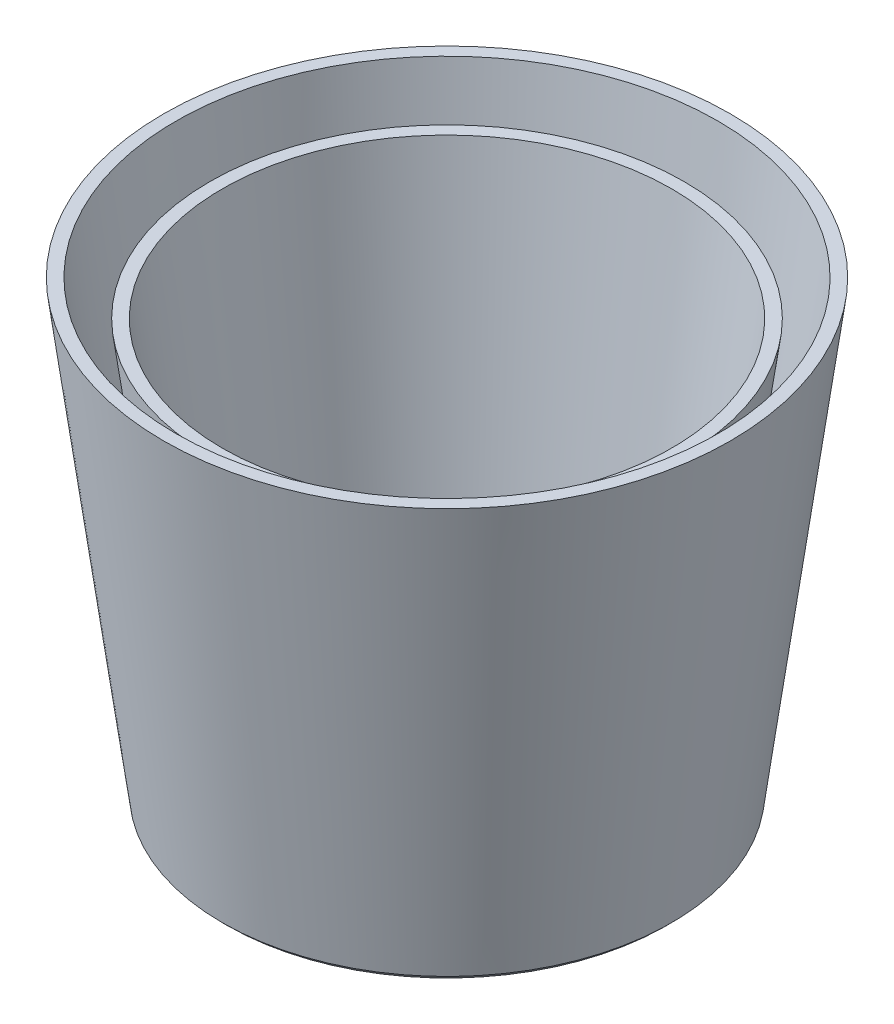
ISO-10303-21;
HEADER;
FILE_DESCRIPTION(('STEP AP214'),'2;1');
FILE_NAME('part.step','',(''),(''),'','','');
FILE_SCHEMA(('AUTOMOTIVE_DESIGN { 1 0 10303 214 1 1 1 1 }'));
ENDSEC;
DATA;
#1=APPLICATION_CONTEXT('core data for automotive mechanical design processes');
#2=APPLICATION_PROTOCOL_DEFINITION('international standard','automotive_design',2000,#1);
#3=PRODUCT_CONTEXT('',#1,'mechanical');
#4=PRODUCT('Part','Part','',(#3));
#5=PRODUCT_RELATED_PRODUCT_CATEGORY('part','',(#4));
#6=PRODUCT_DEFINITION_FORMATION('','',#4);
#7=PRODUCT_DEFINITION_CONTEXT('part definition',#1,'design');
#8=PRODUCT_DEFINITION('design','',#6,#7);
#9=PRODUCT_DEFINITION_SHAPE('','',#8);
#10=(LENGTH_UNIT() NAMED_UNIT(*) SI_UNIT(.MILLI.,.METRE.));
#11=(NAMED_UNIT(*) PLANE_ANGLE_UNIT() SI_UNIT($,.RADIAN.));
#12=(NAMED_UNIT(*) SI_UNIT($,.STERADIAN.) SOLID_ANGLE_UNIT());
#13=UNCERTAINTY_MEASURE_WITH_UNIT(LENGTH_MEASURE(1.E-05),#10,'distance_accuracy_value','');
#14=(GEOMETRIC_REPRESENTATION_CONTEXT(3) GLOBAL_UNCERTAINTY_ASSIGNED_CONTEXT((#13)) GLOBAL_UNIT_ASSIGNED_CONTEXT((#10,
#11,#12)) REPRESENTATION_CONTEXT('',''));
#15=CARTESIAN_POINT('',(0.,0.,0.));
#16=DIRECTION('',(0.,0.,1.));
#17=DIRECTION('',(1.,0.,0.));
#18=AXIS2_PLACEMENT_3D('',#15,#16,#17);
#19=CARTESIAN_POINT('',(0.,-108.,0.));
#20=DIRECTION('',(0.,1.,0.));
#21=DIRECTION('',(0.,0.,1.));
#22=AXIS2_PLACEMENT_3D('',#19,#20,#21);
#23=PLANE('',#22);
#24=CARTESIAN_POINT('',(0.,-108.,2.99999999999999));
#25=DIRECTION('',(0.,1.,0.));
#26=DIRECTION('',(0.,0.,1.));
#27=AXIS2_PLACEMENT_3D('',#24,#25,#26);
#28=CIRCLE('',#27,53.4015254030305);
#29=CARTESIAN_POINT('',(0.,-108.,56.4015254030305));
#30=VERTEX_POINT('',#29);
#31=EDGE_CURVE('E10',#30,#30,#28,.F.);
#32=ORIENTED_EDGE('',*,*,#31,.T.);
#33=EDGE_LOOP('',(#32));
#34=FACE_BOUND('',#33,.T.);
#35=ADVANCED_FACE('F39',(#34),#23,.F.);
#36=CARTESIAN_POINT('',(0.,-1.30454512571389,3.));
#37=DIRECTION('',(0.,1.,0.));
#38=DIRECTION('',(0.,0.,1.));
#39=AXIS2_PLACEMENT_3D('',#36,#37,#38);
#40=CONICAL_SURFACE('',#39,68.4404010443839,0.130827396074056);
#41=CARTESIAN_POINT('',(0.,-106.848484848485,2.99999999999999));
#42=DIRECTION('',(0.,-1.,0.));
#43=DIRECTION('',(0.,0.,-1.));
#44=AXIS2_PLACEMENT_3D('',#41,#42,#43);
#45=CIRCLE('',#44,54.5530405545457);
#46=CARTESIAN_POINT('',(0.,-106.848484848485,-51.5530405545457));
#47=VERTEX_POINT('',#46);
#48=EDGE_CURVE('E48',#47,#47,#45,.F.);
#49=ORIENTED_EDGE('',*,*,#48,.T.);
#50=EDGE_LOOP('',(#49));
#51=FACE_BOUND('',#50,.T.);
#52=CARTESIAN_POINT('',(0.,1.65066987090594,3.));
#53=DIRECTION('',(0.,1.,0.));
#54=DIRECTION('',(0.,0.,1.));
#55=AXIS2_PLACEMENT_3D('',#52,#53,#54);
#56=CIRCLE('',#55,68.8292451228865);
#57=CARTESIAN_POINT('',(0.,1.65066987090593,71.8292451228865));
#58=VERTEX_POINT('',#57);
#59=EDGE_CURVE('E144',#58,#58,#56,.T.);
#60=ORIENTED_EDGE('',*,*,#59,.F.);
#61=EDGE_LOOP('',(#60));
#62=FACE_BOUND('',#61,.T.);
#63=ADVANCED_FACE('F275',(#51,#62),#40,.T.);
#64=CARTESIAN_POINT('',(0.,1.65066987090594,-62.803387033928));
#65=DIRECTION('',(0.,-1.,0.));
#66=DIRECTION('',(0.,0.,-1.));
#67=AXIS2_PLACEMENT_3D('',#64,#65,#66);
#68=PLANE('',#67);
#69=CARTESIAN_POINT('',(0.,1.65066987090594,3.));
#70=DIRECTION('',(0.,1.,0.));
#71=DIRECTION('',(0.,0.,1.));
#72=AXIS2_PLACEMENT_3D('',#69,#70,#71);
#73=CIRCLE('',#72,65.803387033928);
#74=CARTESIAN_POINT('',(0.,1.65066987090593,68.803387033928));
#75=VERTEX_POINT('',#74);
#76=EDGE_CURVE('E148',#75,#75,#73,.T.);
#77=ORIENTED_EDGE('',*,*,#76,.F.);
#78=EDGE_LOOP('',(#77));
#79=FACE_BOUND('',#78,.T.);
#80=ORIENTED_EDGE('',*,*,#59,.T.);
#81=EDGE_LOOP('',(#80));
#82=FACE_BOUND('',#81,.T.);
#83=ADVANCED_FACE('F280',(#79,#82),#68,.F.);
#84=CARTESIAN_POINT('',(0.,0.,3.));
#85=DIRECTION('',(0.,1.,0.));
#86=DIRECTION('',(0.,0.,1.));
#87=AXIS2_PLACEMENT_3D('',#84,#85,#86);
#88=CONICAL_SURFACE('',#87,65.5861936298615,0.130827396074057);
#89=CARTESIAN_POINT('',(0.,-105.,2.99999999999999));
#90=DIRECTION('',(0.,1.,0.));
#91=DIRECTION('',(0.,0.,1.));
#92=AXIS2_PLACEMENT_3D('',#89,#90,#91);
#93=CIRCLE('',#92,51.7704041561773);
#94=CARTESIAN_POINT('',(0.,-105.,54.7704041561773));
#95=VERTEX_POINT('',#94);
#96=EDGE_CURVE('E152',#95,#95,#93,.T.);
#97=ORIENTED_EDGE('',*,*,#96,.F.);
#98=EDGE_LOOP('',(#97));
#99=FACE_BOUND('',#98,.T.);
#100=ORIENTED_EDGE('',*,*,#76,.T.);
#101=EDGE_LOOP('',(#100));
#102=FACE_BOUND('',#101,.T.);
#103=ADVANCED_FACE('F440',(#99,#102),#88,.F.);
#104=CARTESIAN_POINT('',(0.,-105.,0.));
#105=DIRECTION('',(0.,-1.,0.));
#106=DIRECTION('',(0.,0.,-1.));
#107=AXIS2_PLACEMENT_3D('',#104,#105,#106);
#108=PLANE('',#107);
#109=CARTESIAN_POINT('',(-30.4338085214448,-105.,12.8885438199986));
#110=DIRECTION('',(0.,-1.,0.));
#111=DIRECTION('',(0.,0.,-1.));
#112=AXIS2_PLACEMENT_3D('',#109,#110,#111);
#113=CIRCLE('',#112,8.);
#114=CARTESIAN_POINT('',(-30.4338085214448,-105.,4.88854381999865));
#115=VERTEX_POINT('',#114);
#116=EDGE_CURVE('E76',#115,#115,#113,.T.);
#117=ORIENTED_EDGE('',*,*,#116,.T.);
#118=EDGE_LOOP('',(#117));
#119=FACE_BOUND('',#118,.T.);
#120=CARTESIAN_POINT('',(-18.8091280733594,-105.,-22.8885438199982));
#121=DIRECTION('',(0.,-1.,0.));
#122=DIRECTION('',(0.,0.,-1.));
#123=AXIS2_PLACEMENT_3D('',#120,#121,#122);
#124=CIRCLE('',#123,8.);
#125=CARTESIAN_POINT('',(-18.8091280733594,-105.,-30.8885438199982));
#126=VERTEX_POINT('',#125);
#127=EDGE_CURVE('E92',#126,#126,#124,.T.);
#128=ORIENTED_EDGE('',*,*,#127,.T.);
#129=EDGE_LOOP('',(#128));
#130=FACE_BOUND('',#129,.T.);
#131=CARTESIAN_POINT('',(18.809128073359,-105.,-22.8885438199984));
#132=DIRECTION('',(0.,-1.,0.));
#133=DIRECTION('',(0.,0.,-1.));
#134=AXIS2_PLACEMENT_3D('',#131,#132,#133);
#135=CIRCLE('',#134,8.);
#136=CARTESIAN_POINT('',(18.809128073359,-105.,-30.8885438199984));
#137=VERTEX_POINT('',#136);
#138=EDGE_CURVE('E108',#137,#137,#135,.T.);
#139=ORIENTED_EDGE('',*,*,#138,.T.);
#140=EDGE_LOOP('',(#139));
#141=FACE_BOUND('',#140,.T.);
#142=CARTESIAN_POINT('',(30.433808521445,-105.,12.8885438199982));
#143=DIRECTION('',(0.,-1.,0.));
#144=DIRECTION('',(0.,0.,-1.));
#145=AXIS2_PLACEMENT_3D('',#142,#143,#144);
#146=CIRCLE('',#145,8.);
#147=CARTESIAN_POINT('',(30.433808521445,-105.,4.88854381999822));
#148=VERTEX_POINT('',#147);
#149=EDGE_CURVE('E124',#148,#148,#146,.T.);
#150=ORIENTED_EDGE('',*,*,#149,.T.);
#151=EDGE_LOOP('',(#150));
#152=FACE_BOUND('',#151,.T.);
#153=CARTESIAN_POINT('',(0.,-105.,35.));
#154=DIRECTION('',(0.,-1.,0.));
#155=DIRECTION('',(0.,0.,-1.));
#156=AXIS2_PLACEMENT_3D('',#153,#154,#155);
#157=CIRCLE('',#156,8.);
#158=CARTESIAN_POINT('',(0.,-105.,27.));
#159=VERTEX_POINT('',#158);
#160=EDGE_CURVE('E140',#159,#159,#157,.T.);
#161=ORIENTED_EDGE('',*,*,#160,.T.);
#162=EDGE_LOOP('',(#161));
#163=FACE_BOUND('',#162,.T.);
#164=ORIENTED_EDGE('',*,*,#96,.T.);
#165=EDGE_LOOP('',(#164));
#166=FACE_BOUND('',#165,.T.);
#167=ADVANCED_FACE('F249',(#119,#130,#141,#152,#163,#166),#108,.F.);
#168=CARTESIAN_POINT('',(0.,-98.,0.));
#169=DIRECTION('',(0.,1.,0.));
#170=DIRECTION('',(0.,0.,1.));
#171=AXIS2_PLACEMENT_3D('',#168,#169,#170);
#172=PLANE('',#171);
#173=CARTESIAN_POINT('',(-31.3848650377401,-98.,-7.19756081437319));
#174=DIRECTION('',(0.,1.,0.));
#175=DIRECTION('',(0.,0.,1.));
#176=AXIS2_PLACEMENT_3D('',#173,#174,#175);
#177=CIRCLE('',#176,2.5);
#178=CARTESIAN_POINT('',(-31.3848650377401,-98.,-4.69756081437319));
#179=VERTEX_POINT('',#178);
#180=EDGE_CURVE('E184',#179,#179,#177,.T.);
#181=ORIENTED_EDGE('',*,*,#180,.T.);
#182=EDGE_LOOP('',(#181));
#183=FACE_BOUND('',#182,.T.);
#184=CARTESIAN_POINT('',(-19.3969133256515,-98.,29.6975608143734));
#185=DIRECTION('',(0.,1.,0.));
#186=DIRECTION('',(0.,0.,1.));
#187=AXIS2_PLACEMENT_3D('',#184,#185,#186);
#188=CIRCLE('',#187,2.5);
#189=CARTESIAN_POINT('',(-19.3969133256515,-98.,32.1975608143734));
#190=VERTEX_POINT('',#189);
#191=EDGE_CURVE('E188',#190,#190,#188,.T.);
#192=ORIENTED_EDGE('',*,*,#191,.T.);
#193=EDGE_LOOP('',(#192));
#194=FACE_BOUND('',#193,.T.);
#195=CARTESIAN_POINT('',(19.3969133256518,-98.,29.6975608143731));
#196=DIRECTION('',(0.,1.,0.));
#197=DIRECTION('',(0.,0.,1.));
#198=AXIS2_PLACEMENT_3D('',#195,#196,#197);
#199=CIRCLE('',#198,2.5);
#200=CARTESIAN_POINT('',(19.3969133256518,-98.,32.1975608143731));
#201=VERTEX_POINT('',#200);
#202=EDGE_CURVE('E192',#201,#201,#199,.T.);
#203=ORIENTED_EDGE('',*,*,#202,.T.);
#204=EDGE_LOOP('',(#203));
#205=FACE_BOUND('',#204,.T.);
#206=CARTESIAN_POINT('',(31.38486503774,-98.,-7.19756081437363));
#207=DIRECTION('',(0.,1.,0.));
#208=DIRECTION('',(0.,0.,1.));
#209=AXIS2_PLACEMENT_3D('',#206,#207,#208);
#210=CIRCLE('',#209,2.5);
#211=CARTESIAN_POINT('',(31.38486503774,-98.,-4.69756081437363));
#212=VERTEX_POINT('',#211);
#213=EDGE_CURVE('E196',#212,#212,#210,.T.);
#214=ORIENTED_EDGE('',*,*,#213,.T.);
#215=EDGE_LOOP('',(#214));
#216=FACE_BOUND('',#215,.T.);
#217=CARTESIAN_POINT('',(0.,-98.,-30.));
#218=DIRECTION('',(0.,1.,0.));
#219=DIRECTION('',(0.,0.,1.));
#220=AXIS2_PLACEMENT_3D('',#217,#218,#219);
#221=CIRCLE('',#220,2.5);
#222=CARTESIAN_POINT('',(0.,-98.,-27.5));
#223=VERTEX_POINT('',#222);
#224=EDGE_CURVE('E176',#223,#223,#221,.T.);
#225=ORIENTED_EDGE('',*,*,#224,.T.);
#226=EDGE_LOOP('',(#225));
#227=FACE_BOUND('',#226,.T.);
#228=CARTESIAN_POINT('',(0.,-98.,3.1615013711249));
#229=DIRECTION('',(0.,1.,0.));
#230=DIRECTION('',(0.,0.,1.));
#231=AXIS2_PLACEMENT_3D('',#228,#229,#230);
#232=CIRCLE('',#231,4.);
#233=CARTESIAN_POINT('',(0.,-98.,7.1615013711249));
#234=VERTEX_POINT('',#233);
#235=EDGE_CURVE('E168',#234,#234,#232,.T.);
#236=ORIENTED_EDGE('',*,*,#235,.T.);
#237=EDGE_LOOP('',(#236));
#238=FACE_BOUND('',#237,.T.);
#239=CARTESIAN_POINT('',(-30.4338085214448,-98.,12.8885438199986));
#240=DIRECTION('',(0.,1.,0.));
#241=DIRECTION('',(0.,0.,1.));
#242=AXIS2_PLACEMENT_3D('',#239,#240,#241);
#243=CIRCLE('',#242,8.);
#244=CARTESIAN_POINT('',(-30.4338085214448,-98.,20.8885438199986));
#245=VERTEX_POINT('',#244);
#246=EDGE_CURVE('E64',#245,#245,#243,.T.);
#247=ORIENTED_EDGE('',*,*,#246,.T.);
#248=EDGE_LOOP('',(#247));
#249=FACE_BOUND('',#248,.T.);
#250=CARTESIAN_POINT('',(-18.8091280733594,-98.,-22.8885438199982));
#251=DIRECTION('',(0.,1.,0.));
#252=DIRECTION('',(0.,0.,1.));
#253=AXIS2_PLACEMENT_3D('',#250,#251,#252);
#254=CIRCLE('',#253,8.);
#255=CARTESIAN_POINT('',(-18.8091280733594,-98.,-14.8885438199982));
#256=VERTEX_POINT('',#255);
#257=EDGE_CURVE('E80',#256,#256,#254,.T.);
#258=ORIENTED_EDGE('',*,*,#257,.T.);
#259=EDGE_LOOP('',(#258));
#260=FACE_BOUND('',#259,.T.);
#261=CARTESIAN_POINT('',(18.809128073359,-98.,-22.8885438199984));
#262=DIRECTION('',(0.,1.,0.));
#263=DIRECTION('',(0.,0.,1.));
#264=AXIS2_PLACEMENT_3D('',#261,#262,#263);
#265=CIRCLE('',#264,8.);
#266=CARTESIAN_POINT('',(18.809128073359,-98.,-14.8885438199984));
#267=VERTEX_POINT('',#266);
#268=EDGE_CURVE('E96',#267,#267,#265,.T.);
#269=ORIENTED_EDGE('',*,*,#268,.T.);
#270=EDGE_LOOP('',(#269));
#271=FACE_BOUND('',#270,.T.);
#272=CARTESIAN_POINT('',(30.433808521445,-98.,12.8885438199982));
#273=DIRECTION('',(0.,1.,0.));
#274=DIRECTION('',(0.,0.,1.));
#275=AXIS2_PLACEMENT_3D('',#272,#273,#274);
#276=CIRCLE('',#275,8.);
#277=CARTESIAN_POINT('',(30.433808521445,-98.,20.8885438199982));
#278=VERTEX_POINT('',#277);
#279=EDGE_CURVE('E112',#278,#278,#276,.T.);
#280=ORIENTED_EDGE('',*,*,#279,.T.);
#281=EDGE_LOOP('',(#280));
#282=FACE_BOUND('',#281,.T.);
#283=CARTESIAN_POINT('',(0.,-98.,35.));
#284=DIRECTION('',(0.,1.,0.));
#285=DIRECTION('',(0.,0.,1.));
#286=AXIS2_PLACEMENT_3D('',#283,#284,#285);
#287=CIRCLE('',#286,8.);
#288=CARTESIAN_POINT('',(0.,-98.,43.));
#289=VERTEX_POINT('',#288);
#290=EDGE_CURVE('E128',#289,#289,#287,.T.);
#291=ORIENTED_EDGE('',*,*,#290,.T.);
#292=EDGE_LOOP('',(#291));
#293=FACE_BOUND('',#292,.T.);
#294=CARTESIAN_POINT('',(0.,-98.,2.99999999999999));
#295=DIRECTION('',(0.,1.,0.));
#296=DIRECTION('',(0.,0.,1.));
#297=AXIS2_PLACEMENT_3D('',#294,#295,#296);
#298=CIRCLE('',#297,45.6311212468532);
#299=CARTESIAN_POINT('',(0.,-98.,48.6311212468532));
#300=VERTEX_POINT('',#299);
#301=EDGE_CURVE('E156',#300,#300,#298,.T.);
#302=ORIENTED_EDGE('',*,*,#301,.F.);
#303=EDGE_LOOP('',(#302));
#304=FACE_BOUND('',#303,.T.);
#305=ADVANCED_FACE('F245',(#183,#194,#205,#216,#227,#238,#249,#260,#271,#282,#293,#304),#172,.F.);
#306=CARTESIAN_POINT('',(0.,-98.,2.99999999999999));
#307=DIRECTION('',(0.,1.,0.));
#308=DIRECTION('',(0.,0.,1.));
#309=AXIS2_PLACEMENT_3D('',#306,#307,#308);
#310=CONICAL_SURFACE('',#309,45.6311212468532,0.130827396074057);
#311=CARTESIAN_POINT('',(0.,-7.00000000000002,3.));
#312=DIRECTION('',(0.,1.,0.));
#313=DIRECTION('',(0.,0.,1.));
#314=AXIS2_PLACEMENT_3D('',#311,#312,#313);
#315=CIRCLE('',#314,57.6048054573795);
#316=CARTESIAN_POINT('',(0.,-7.00000000000003,60.6048054573795));
#317=VERTEX_POINT('',#316);
#318=EDGE_CURVE('E160',#317,#317,#315,.T.);
#319=ORIENTED_EDGE('',*,*,#318,.F.);
#320=EDGE_LOOP('',(#319));
#321=FACE_BOUND('',#320,.T.);
#322=ORIENTED_EDGE('',*,*,#301,.T.);
#323=EDGE_LOOP('',(#322));
#324=FACE_BOUND('',#323,.T.);
#325=ADVANCED_FACE('F248',(#321,#324),#310,.T.);
#326=CARTESIAN_POINT('',(0.,-7.,-51.5789473684211));
#327=DIRECTION('',(0.,-1.,0.));
#328=DIRECTION('',(0.,0.,-1.));
#329=AXIS2_PLACEMENT_3D('',#326,#327,#328);
#330=PLANE('',#329);
#331=CARTESIAN_POINT('',(0.,-7.00000000000002,3.));
#332=DIRECTION('',(0.,1.,0.));
#333=DIRECTION('',(0.,0.,1.));
#334=AXIS2_PLACEMENT_3D('',#331,#332,#333);
#335=CIRCLE('',#334,54.5789473684211);
#336=CARTESIAN_POINT('',(0.,-7.00000000000003,57.5789473684211));
#337=VERTEX_POINT('',#336);
#338=EDGE_CURVE('E164',#337,#337,#335,.T.);
#339=ORIENTED_EDGE('',*,*,#338,.F.);
#340=EDGE_LOOP('',(#339));
#341=FACE_BOUND('',#340,.T.);
#342=ORIENTED_EDGE('',*,*,#318,.T.);
#343=EDGE_LOOP('',(#342));
#344=FACE_BOUND('',#343,.T.);
#345=ADVANCED_FACE('F265',(#341,#344),#330,.F.);
#346=CARTESIAN_POINT('',(0.,-7.00000000000002,3.));
#347=DIRECTION('',(0.,1.,0.));
#348=DIRECTION('',(0.,0.,1.));
#349=AXIS2_PLACEMENT_3D('',#346,#347,#348);
#350=CONICAL_SURFACE('',#349,54.5789473684211,0.130827396074057);
#351=CARTESIAN_POINT('',(0.,-92.3913635377142,2.99999999999999));
#352=DIRECTION('',(0.,1.,0.));
#353=DIRECTION('',(0.,0.,1.));
#354=AXIS2_PLACEMENT_3D('',#351,#352,#353);
#355=CIRCLE('',#354,43.3432416397745);
#356=CARTESIAN_POINT('',(0.,-92.3913635377142,46.3432416397744));
#357=VERTEX_POINT('',#356);
#358=EDGE_CURVE('E53',#357,#357,#355,.F.);
#359=ORIENTED_EDGE('',*,*,#358,.T.);
#360=EDGE_LOOP('',(#359));
#361=FACE_BOUND('',#360,.T.);
#362=ORIENTED_EDGE('',*,*,#338,.T.);
#363=EDGE_LOOP('',(#362));
#364=FACE_BOUND('',#363,.T.);
#365=ADVANCED_FACE('F224',(#361,#364),#350,.F.);
#366=CARTESIAN_POINT('',(0.,-95.,0.));
#367=DIRECTION('',(0.,-1.,0.));
#368=DIRECTION('',(0.,0.,-1.));
#369=AXIS2_PLACEMENT_3D('',#366,#367,#368);
#370=PLANE('',#369);
#371=CARTESIAN_POINT('',(0.,-95.,2.99999999999999));
#372=DIRECTION('',(0.,-1.,0.));
#373=DIRECTION('',(0.,0.,-1.));
#374=AXIS2_PLACEMENT_3D('',#371,#372,#373);
#375=CIRCLE('',#374,40.3688787531468);
#376=CARTESIAN_POINT('',(0.,-95.,-37.3688787531468));
#377=VERTEX_POINT('',#376);
#378=EDGE_CURVE('E58',#377,#377,#375,.F.);
#379=ORIENTED_EDGE('',*,*,#378,.T.);
#380=EDGE_LOOP('',(#379));
#381=FACE_BOUND('',#380,.T.);
#382=CARTESIAN_POINT('',(-31.3848650377401,-95.,-7.19756081437319));
#383=DIRECTION('',(0.,1.,0.));
#384=DIRECTION('',(0.951056516295155,0.,0.309016994374945));
#385=AXIS2_PLACEMENT_3D('',#382,#383,#384);
#386=CIRCLE('',#385,2.5);
#387=CARTESIAN_POINT('',(-29.0072237470022,-95.,-6.42501832843583));
#388=VERTEX_POINT('',#387);
#389=EDGE_CURVE('E200',#388,#388,#386,.T.);
#390=ORIENTED_EDGE('',*,*,#389,.F.);
#391=EDGE_LOOP('',(#390));
#392=FACE_BOUND('',#391,.T.);
#393=CARTESIAN_POINT('',(-19.3969133256515,-95.,29.6975608143734));
#394=DIRECTION('',(0.,1.,0.));
#395=DIRECTION('',(0.587785252292469,0.,-0.809016994374951));
#396=AXIS2_PLACEMENT_3D('',#393,#394,#395);
#397=CIRCLE('',#396,2.5);
#398=CARTESIAN_POINT('',(-17.9274501949203,-95.,27.675018328436));
#399=VERTEX_POINT('',#398);
#400=EDGE_CURVE('E209',#399,#399,#397,.T.);
#401=ORIENTED_EDGE('',*,*,#400,.F.);
#402=EDGE_LOOP('',(#401));
#403=FACE_BOUND('',#402,.T.);
#404=CARTESIAN_POINT('',(19.3969133256518,-95.,29.6975608143731));
#405=DIRECTION('',(0.,1.,0.));
#406=DIRECTION('',(-0.58778525229248,0.,-0.809016994374942));
#407=AXIS2_PLACEMENT_3D('',#404,#405,#406);
#408=CIRCLE('',#407,2.5);
#409=CARTESIAN_POINT('',(17.9274501949206,-95.,27.6750183284357));
#410=VERTEX_POINT('',#409);
#411=EDGE_CURVE('E205',#410,#410,#408,.T.);
#412=ORIENTED_EDGE('',*,*,#411,.F.);
#413=EDGE_LOOP('',(#412));
#414=FACE_BOUND('',#413,.T.);
#415=CARTESIAN_POINT('',(31.38486503774,-95.,-7.19756081437363));
#416=DIRECTION('',(0.,1.,0.));
#417=DIRECTION('',(-0.95105651629515,0.,0.309016994374958));
#418=AXIS2_PLACEMENT_3D('',#415,#416,#417);
#419=CIRCLE('',#418,2.5);
#420=CARTESIAN_POINT('',(29.0072237470021,-95.,-6.42501832843624));
#421=VERTEX_POINT('',#420);
#422=EDGE_CURVE('E201',#421,#421,#419,.T.);
#423=ORIENTED_EDGE('',*,*,#422,.F.);
#424=EDGE_LOOP('',(#423));
#425=FACE_BOUND('',#424,.T.);
#426=CARTESIAN_POINT('',(0.,-95.,-30.));
#427=DIRECTION('',(0.,1.,0.));
#428=DIRECTION('',(0.,0.,1.));
#429=AXIS2_PLACEMENT_3D('',#426,#427,#428);
#430=CIRCLE('',#429,2.5);
#431=CARTESIAN_POINT('',(0.,-95.,-27.5));
#432=VERTEX_POINT('',#431);
#433=EDGE_CURVE('E180',#432,#432,#430,.T.);
#434=ORIENTED_EDGE('',*,*,#433,.F.);
#435=EDGE_LOOP('',(#434));
#436=FACE_BOUND('',#435,.T.);
#437=CARTESIAN_POINT('',(0.,-95.,3.16150137112491));
#438=DIRECTION('',(0.,1.,0.));
#439=DIRECTION('',(0.,0.,1.));
#440=AXIS2_PLACEMENT_3D('',#437,#438,#439);
#441=CIRCLE('',#440,4.);
#442=CARTESIAN_POINT('',(0.,-95.,7.16150137112491));
#443=VERTEX_POINT('',#442);
#444=EDGE_CURVE('E172',#443,#443,#441,.T.);
#445=ORIENTED_EDGE('',*,*,#444,.F.);
#446=EDGE_LOOP('',(#445));
#447=FACE_BOUND('',#446,.T.);
#448=ADVANCED_FACE('F220',(#381,#392,#403,#414,#425,#436,#447),#370,.F.);
#449=CARTESIAN_POINT('',(0.,-80.857864376269,35.));
#450=DIRECTION('',(0.,-1.,0.));
#451=DIRECTION('',(0.,0.,-1.));
#452=AXIS2_PLACEMENT_3D('',#449,#450,#451);
#453=CYLINDRICAL_SURFACE('',#452,5.);
#454=CARTESIAN_POINT('',(0.,-102.,35.));
#455=DIRECTION('',(0.,-1.,0.));
#456=DIRECTION('',(0.,0.,-1.));
#457=AXIS2_PLACEMENT_3D('',#454,#455,#456);
#458=CIRCLE('',#457,5.);
#459=CARTESIAN_POINT('',(0.,-102.,30.));
#460=VERTEX_POINT('',#459);
#461=EDGE_CURVE('E132',#460,#460,#458,.F.);
#462=ORIENTED_EDGE('',*,*,#461,.T.);
#463=EDGE_LOOP('',(#462));
#464=FACE_BOUND('',#463,.T.);
#465=CARTESIAN_POINT('',(0.,-101.,35.));
#466=DIRECTION('',(0.,1.,0.));
#467=DIRECTION('',(0.,0.,1.));
#468=AXIS2_PLACEMENT_3D('',#465,#466,#467);
#469=CIRCLE('',#468,5.);
#470=CARTESIAN_POINT('',(0.,-101.,40.));
#471=VERTEX_POINT('',#470);
#472=EDGE_CURVE('E136',#471,#471,#469,.F.);
#473=ORIENTED_EDGE('',*,*,#472,.T.);
#474=EDGE_LOOP('',(#473));
#475=FACE_BOUND('',#474,.T.);
#476=ADVANCED_FACE('F223',(#464,#475),#453,.T.);
#477=CARTESIAN_POINT('',(0.,-102.,35.));
#478=DIRECTION('',(0.,-1.,0.));
#479=DIRECTION('',(0.,0.,-1.));
#480=AXIS2_PLACEMENT_3D('',#477,#478,#479);
#481=TOROIDAL_SURFACE('',#480,8.,3.);
#482=ORIENTED_EDGE('',*,*,#461,.F.);
#483=EDGE_LOOP('',(#482));
#484=FACE_BOUND('',#483,.T.);
#485=ORIENTED_EDGE('',*,*,#160,.F.);
#486=EDGE_LOOP('',(#485));
#487=FACE_BOUND('',#486,.T.);
#488=ADVANCED_FACE('F284',(#484,#487),#481,.F.);
#489=CARTESIAN_POINT('',(0.,-101.,35.));
#490=DIRECTION('',(0.,1.,0.));
#491=DIRECTION('',(0.,0.,1.));
#492=AXIS2_PLACEMENT_3D('',#489,#490,#491);
#493=TOROIDAL_SURFACE('',#492,8.,3.);
#494=ORIENTED_EDGE('',*,*,#472,.F.);
#495=EDGE_LOOP('',(#494));
#496=FACE_BOUND('',#495,.T.);
#497=ORIENTED_EDGE('',*,*,#290,.F.);
#498=EDGE_LOOP('',(#497));
#499=FACE_BOUND('',#498,.T.);
#500=ADVANCED_FACE('F287',(#496,#499),#493,.F.);
#501=CARTESIAN_POINT('',(30.433808521445,-80.857864376269,12.8885438199982));
#502=DIRECTION('',(0.,-1.,0.));
#503=DIRECTION('',(0.,0.,-1.));
#504=AXIS2_PLACEMENT_3D('',#501,#502,#503);
#505=CYLINDRICAL_SURFACE('',#504,5.);
#506=CARTESIAN_POINT('',(30.433808521445,-102.,12.8885438199982));
#507=DIRECTION('',(0.,-1.,0.));
#508=DIRECTION('',(0.,0.,-1.));
#509=AXIS2_PLACEMENT_3D('',#506,#507,#508);
#510=CIRCLE('',#509,5.);
#511=CARTESIAN_POINT('',(30.433808521445,-102.,7.88854381999822));
#512=VERTEX_POINT('',#511);
#513=EDGE_CURVE('E116',#512,#512,#510,.F.);
#514=CARTESIAN_POINT('',(30.433808521445,-101.,12.8885438199982));
#515=DIRECTION('',(0.,1.,0.));
#516=DIRECTION('',(0.,0.,1.));
#517=AXIS2_PLACEMENT_3D('',#514,#515,#516);
#518=CIRCLE('',#517,5.);
#519=CARTESIAN_POINT('',(30.433808521445,-101.,7.88854381999822));
#520=VERTEX_POINT('',#519);
#521=EDGE_CURVE('E120',#520,#520,#518,.F.);
#522=CARTESIAN_POINT('',(30.433808521445,-102.,7.88854381999822));
#523=CARTESIAN_POINT('',(30.433808521445,-101.989583333333,7.88854381999822));
#524=CARTESIAN_POINT('',(30.433808521445,-101.979166666667,7.88854381999822));
#525=CARTESIAN_POINT('',(30.433808521445,-101.958333333333,7.88854381999822));
#526=CARTESIAN_POINT('',(30.433808521445,-101.947916666667,7.88854381999822));
#527=CARTESIAN_POINT('',(30.433808521445,-101.927083333333,7.88854381999822));
#528=CARTESIAN_POINT('',(30.433808521445,-101.916666666667,7.88854381999822));
#529=CARTESIAN_POINT('',(30.433808521445,-101.895833333333,7.88854381999822));
#530=CARTESIAN_POINT('',(30.433808521445,-101.885416666667,7.88854381999822));
#531=CARTESIAN_POINT('',(30.433808521445,-101.864583333333,7.88854381999822));
#532=CARTESIAN_POINT('',(30.433808521445,-101.854166666667,7.88854381999822));
#533=CARTESIAN_POINT('',(30.433808521445,-101.833333333333,7.88854381999822));
#534=CARTESIAN_POINT('',(30.433808521445,-101.822916666667,7.88854381999822));
#535=CARTESIAN_POINT('',(30.433808521445,-101.802083333333,7.88854381999822));
#536=CARTESIAN_POINT('',(30.433808521445,-101.791666666667,7.88854381999822));
#537=CARTESIAN_POINT('',(30.433808521445,-101.770833333333,7.88854381999822));
#538=CARTESIAN_POINT('',(30.433808521445,-101.760416666667,7.88854381999822));
#539=CARTESIAN_POINT('',(30.433808521445,-101.739583333333,7.88854381999822));
#540=CARTESIAN_POINT('',(30.433808521445,-101.729166666667,7.88854381999822));
#541=CARTESIAN_POINT('',(30.433808521445,-101.708333333333,7.88854381999822));
#542=CARTESIAN_POINT('',(30.433808521445,-101.697916666667,7.88854381999822));
#543=CARTESIAN_POINT('',(30.433808521445,-101.677083333333,7.88854381999822));
#544=CARTESIAN_POINT('',(30.433808521445,-101.666666666667,7.88854381999822));
#545=CARTESIAN_POINT('',(30.433808521445,-101.645833333333,7.88854381999822));
#546=CARTESIAN_POINT('',(30.433808521445,-101.635416666667,7.88854381999822));
#547=CARTESIAN_POINT('',(30.433808521445,-101.614583333333,7.88854381999822));
#548=CARTESIAN_POINT('',(30.433808521445,-101.604166666667,7.88854381999822));
#549=CARTESIAN_POINT('',(30.433808521445,-101.583333333333,7.88854381999822));
#550=CARTESIAN_POINT('',(30.433808521445,-101.572916666667,7.88854381999822));
#551=CARTESIAN_POINT('',(30.433808521445,-101.552083333333,7.88854381999822));
#552=CARTESIAN_POINT('',(30.433808521445,-101.541666666667,7.88854381999822));
#553=CARTESIAN_POINT('',(30.433808521445,-101.520833333333,7.88854381999822));
#554=CARTESIAN_POINT('',(30.433808521445,-101.510416666667,7.88854381999822));
#555=CARTESIAN_POINT('',(30.433808521445,-101.489583333333,7.88854381999822));
#556=CARTESIAN_POINT('',(30.433808521445,-101.479166666667,7.88854381999822));
#557=CARTESIAN_POINT('',(30.433808521445,-101.458333333333,7.88854381999822));
#558=CARTESIAN_POINT('',(30.433808521445,-101.447916666667,7.88854381999822));
#559=CARTESIAN_POINT('',(30.433808521445,-101.427083333333,7.88854381999822));
#560=CARTESIAN_POINT('',(30.433808521445,-101.416666666667,7.88854381999822));
#561=CARTESIAN_POINT('',(30.433808521445,-101.395833333333,7.88854381999822));
#562=CARTESIAN_POINT('',(30.433808521445,-101.385416666667,7.88854381999822));
#563=CARTESIAN_POINT('',(30.433808521445,-101.364583333333,7.88854381999822));
#564=CARTESIAN_POINT('',(30.433808521445,-101.354166666667,7.88854381999822));
#565=CARTESIAN_POINT('',(30.433808521445,-101.333333333333,7.88854381999822));
#566=CARTESIAN_POINT('',(30.433808521445,-101.322916666667,7.88854381999822));
#567=CARTESIAN_POINT('',(30.433808521445,-101.302083333333,7.88854381999822));
#568=CARTESIAN_POINT('',(30.433808521445,-101.291666666667,7.88854381999822));
#569=CARTESIAN_POINT('',(30.433808521445,-101.270833333333,7.88854381999822));
#570=CARTESIAN_POINT('',(30.433808521445,-101.260416666667,7.88854381999822));
#571=CARTESIAN_POINT('',(30.433808521445,-101.239583333333,7.88854381999822));
#572=CARTESIAN_POINT('',(30.433808521445,-101.229166666667,7.88854381999822));
#573=CARTESIAN_POINT('',(30.433808521445,-101.208333333333,7.88854381999822));
#574=CARTESIAN_POINT('',(30.433808521445,-101.197916666667,7.88854381999822));
#575=CARTESIAN_POINT('',(30.433808521445,-101.177083333333,7.88854381999822));
#576=CARTESIAN_POINT('',(30.433808521445,-101.166666666667,7.88854381999822));
#577=CARTESIAN_POINT('',(30.433808521445,-101.145833333333,7.88854381999822));
#578=CARTESIAN_POINT('',(30.433808521445,-101.135416666667,7.88854381999822));
#579=CARTESIAN_POINT('',(30.433808521445,-101.114583333333,7.88854381999822));
#580=CARTESIAN_POINT('',(30.433808521445,-101.104166666667,7.88854381999822));
#581=CARTESIAN_POINT('',(30.433808521445,-101.083333333333,7.88854381999822));
#582=CARTESIAN_POINT('',(30.433808521445,-101.072916666667,7.88854381999822));
#583=CARTESIAN_POINT('',(30.433808521445,-101.052083333333,7.88854381999822));
#584=CARTESIAN_POINT('',(30.433808521445,-101.041666666667,7.88854381999822));
#585=CARTESIAN_POINT('',(30.433808521445,-101.020833333333,7.88854381999822));
#586=CARTESIAN_POINT('',(30.433808521445,-101.010416666667,7.88854381999822));
#587=CARTESIAN_POINT('',(30.433808521445,-101.,7.88854381999822));
#588=B_SPLINE_CURVE_WITH_KNOTS('',3,(#522,#523,#524,#525,#526,#527,#528,#529,#530,#531,#532,
#533,#534,#535,#536,#537,#538,#539,#540,#541,#542,#543,#544,#545,#546,#547,#548,#549,#550,#551,
#552,#553,#554,#555,#556,#557,#558,#559,#560,#561,#562,#563,#564,#565,#566,#567,#568,#569,#570,
#571,#572,#573,#574,#575,#576,#577,#578,#579,#580,#581,#582,#583,#584,#585,#586,#587),
.UNSPECIFIED.,.F.,.F.,(4,2,2,2,2,2,2,2,2,2,2,2,2,2,2,2,2,2,2,2,2,2,2,2,2,2,2,2,2,2,2,2,4),(0.,
0.0312499999999966,0.062500000000007,0.0937500000000036,0.125,0.156250000000011,
0.187500000000007,0.218750000000004,0.25,0.281249999999997,0.312500000000007,0.343750000000004,
0.375,0.406249999999997,0.437499999999993,0.468750000000004,0.5,0.531249999999997,
0.562500000000007,0.593750000000004,0.625000000000001,0.656249999999997,0.687499999999994,
0.718750000000004,0.750000000000001,0.781249999999997,0.812499999999994,0.84374999999999,
0.875000000000001,0.906249999999997,0.937499999999994,0.968750000000004,1.),.UNSPECIFIED.);
#589=EDGE_CURVE('BSEAM291',#512,#520,#588,.T.);
#590=ORIENTED_EDGE('',*,*,#513,.T.);
#591=ORIENTED_EDGE('',*,*,#521,.T.);
#592=ORIENTED_EDGE('',*,*,#589,.T.);
#593=ORIENTED_EDGE('',*,*,#589,.F.);
#594=EDGE_LOOP('',(#590,#592,#591,#593));
#595=FACE_BOUND('',#594,.T.);
#596=ADVANCED_FACE('F291',(#595),#505,.T.);
#597=CARTESIAN_POINT('',(18.809128073359,-80.857864376269,-22.8885438199984));
#598=DIRECTION('',(0.,-1.,0.));
#599=DIRECTION('',(0.,0.,-1.));
#600=AXIS2_PLACEMENT_3D('',#597,#598,#599);
#601=CYLINDRICAL_SURFACE('',#600,5.);
#602=CARTESIAN_POINT('',(18.809128073359,-102.,-22.8885438199984));
#603=DIRECTION('',(0.,-1.,0.));
#604=DIRECTION('',(0.,0.,-1.));
#605=AXIS2_PLACEMENT_3D('',#602,#603,#604);
#606=CIRCLE('',#605,5.);
#607=CARTESIAN_POINT('',(18.809128073359,-102.,-27.8885438199984));
#608=VERTEX_POINT('',#607);
#609=EDGE_CURVE('E100',#608,#608,#606,.F.);
#610=ORIENTED_EDGE('',*,*,#609,.T.);
#611=EDGE_LOOP('',(#610));
#612=FACE_BOUND('',#611,.T.);
#613=CARTESIAN_POINT('',(18.809128073359,-101.,-22.8885438199984));
#614=DIRECTION('',(0.,1.,0.));
#615=DIRECTION('',(0.,0.,1.));
#616=AXIS2_PLACEMENT_3D('',#613,#614,#615);
#617=CIRCLE('',#616,5.);
#618=CARTESIAN_POINT('',(18.809128073359,-101.,-17.8885438199984));
#619=VERTEX_POINT('',#618);
#620=EDGE_CURVE('E104',#619,#619,#617,.F.);
#621=ORIENTED_EDGE('',*,*,#620,.T.);
#622=EDGE_LOOP('',(#621));
#623=FACE_BOUND('',#622,.T.);
#624=ADVANCED_FACE('F351',(#612,#623),#601,.T.);
#625=CARTESIAN_POINT('',(-18.8091280733594,-80.8578643762691,-22.8885438199982));
#626=DIRECTION('',(0.,-1.,0.));
#627=DIRECTION('',(0.,0.,-1.));
#628=AXIS2_PLACEMENT_3D('',#625,#626,#627);
#629=CYLINDRICAL_SURFACE('',#628,5.);
#630=CARTESIAN_POINT('',(-18.8091280733594,-102.,-22.8885438199982));
#631=DIRECTION('',(0.,-1.,0.));
#632=DIRECTION('',(0.,0.,-1.));
#633=AXIS2_PLACEMENT_3D('',#630,#631,#632);
#634=CIRCLE('',#633,5.);
#635=CARTESIAN_POINT('',(-18.8091280733594,-102.,-27.8885438199982));
#636=VERTEX_POINT('',#635);
#637=EDGE_CURVE('E84',#636,#636,#634,.F.);
#638=ORIENTED_EDGE('',*,*,#637,.T.);
#639=EDGE_LOOP('',(#638));
#640=FACE_BOUND('',#639,.T.);
#641=CARTESIAN_POINT('',(-18.8091280733594,-101.,-22.8885438199982));
#642=DIRECTION('',(0.,1.,0.));
#643=DIRECTION('',(0.,0.,1.));
#644=AXIS2_PLACEMENT_3D('',#641,#642,#643);
#645=CIRCLE('',#644,5.);
#646=CARTESIAN_POINT('',(-18.8091280733594,-101.,-17.8885438199982));
#647=VERTEX_POINT('',#646);
#648=EDGE_CURVE('E88',#647,#647,#645,.F.);
#649=ORIENTED_EDGE('',*,*,#648,.T.);
#650=EDGE_LOOP('',(#649));
#651=FACE_BOUND('',#650,.T.);
#652=ADVANCED_FACE('F355',(#640,#651),#629,.T.);
#653=CARTESIAN_POINT('',(-30.4338085214448,-80.857864376269,12.8885438199987));
#654=DIRECTION('',(0.,-1.,0.));
#655=DIRECTION('',(0.,0.,-1.));
#656=AXIS2_PLACEMENT_3D('',#653,#654,#655);
#657=CYLINDRICAL_SURFACE('',#656,5.);
#658=CARTESIAN_POINT('',(-30.4338085214448,-102.,12.8885438199986));
#659=DIRECTION('',(0.,-1.,0.));
#660=DIRECTION('',(0.,0.,-1.));
#661=AXIS2_PLACEMENT_3D('',#658,#659,#660);
#662=CIRCLE('',#661,5.);
#663=CARTESIAN_POINT('',(-30.4338085214448,-102.,7.88854381999865));
#664=VERTEX_POINT('',#663);
#665=EDGE_CURVE('E68',#664,#664,#662,.F.);
#666=ORIENTED_EDGE('',*,*,#665,.T.);
#667=EDGE_LOOP('',(#666));
#668=FACE_BOUND('',#667,.T.);
#669=CARTESIAN_POINT('',(-30.4338085214448,-101.,12.8885438199986));
#670=DIRECTION('',(0.,1.,0.));
#671=DIRECTION('',(0.,0.,1.));
#672=AXIS2_PLACEMENT_3D('',#669,#670,#671);
#673=CIRCLE('',#672,5.);
#674=CARTESIAN_POINT('',(-30.4338085214448,-101.,17.8885438199986));
#675=VERTEX_POINT('',#674);
#676=EDGE_CURVE('E72',#675,#675,#673,.F.);
#677=ORIENTED_EDGE('',*,*,#676,.T.);
#678=EDGE_LOOP('',(#677));
#679=FACE_BOUND('',#678,.T.);
#680=ADVANCED_FACE('F297',(#668,#679),#657,.T.);
#681=CARTESIAN_POINT('',(30.433808521445,-102.,12.8885438199982));
#682=DIRECTION('',(0.,-1.,0.));
#683=DIRECTION('',(0.,0.,-1.));
#684=AXIS2_PLACEMENT_3D('',#681,#682,#683);
#685=TOROIDAL_SURFACE('',#684,8.,3.);
#686=ORIENTED_EDGE('',*,*,#513,.F.);
#687=EDGE_LOOP('',(#686));
#688=FACE_BOUND('',#687,.T.);
#689=ORIENTED_EDGE('',*,*,#149,.F.);
#690=EDGE_LOOP('',(#689));
#691=FACE_BOUND('',#690,.T.);
#692=ADVANCED_FACE('F293',(#688,#691),#685,.F.);
#693=CARTESIAN_POINT('',(30.433808521445,-101.,12.8885438199982));
#694=DIRECTION('',(0.,1.,0.));
#695=DIRECTION('',(0.,0.,1.));
#696=AXIS2_PLACEMENT_3D('',#693,#694,#695);
#697=TOROIDAL_SURFACE('',#696,8.,3.);
#698=ORIENTED_EDGE('',*,*,#521,.F.);
#699=EDGE_LOOP('',(#698));
#700=FACE_BOUND('',#699,.T.);
#701=ORIENTED_EDGE('',*,*,#279,.F.);
#702=EDGE_LOOP('',(#701));
#703=FACE_BOUND('',#702,.T.);
#704=ADVANCED_FACE('F296',(#700,#703),#697,.F.);
#705=CARTESIAN_POINT('',(18.809128073359,-102.,-22.8885438199984));
#706=DIRECTION('',(0.,-1.,0.));
#707=DIRECTION('',(0.,0.,-1.));
#708=AXIS2_PLACEMENT_3D('',#705,#706,#707);
#709=TOROIDAL_SURFACE('',#708,8.,3.);
#710=ORIENTED_EDGE('',*,*,#609,.F.);
#711=EDGE_LOOP('',(#710));
#712=FACE_BOUND('',#711,.T.);
#713=ORIENTED_EDGE('',*,*,#138,.F.);
#714=EDGE_LOOP('',(#713));
#715=FACE_BOUND('',#714,.T.);
#716=ADVANCED_FACE('F301',(#712,#715),#709,.F.);
#717=CARTESIAN_POINT('',(18.809128073359,-101.,-22.8885438199984));
#718=DIRECTION('',(0.,1.,0.));
#719=DIRECTION('',(0.,0.,1.));
#720=AXIS2_PLACEMENT_3D('',#717,#718,#719);
#721=TOROIDAL_SURFACE('',#720,8.,3.);
#722=ORIENTED_EDGE('',*,*,#620,.F.);
#723=EDGE_LOOP('',(#722));
#724=FACE_BOUND('',#723,.T.);
#725=ORIENTED_EDGE('',*,*,#268,.F.);
#726=EDGE_LOOP('',(#725));
#727=FACE_BOUND('',#726,.T.);
#728=ADVANCED_FACE('F305',(#724,#727),#721,.F.);
#729=CARTESIAN_POINT('',(-18.8091280733594,-102.,-22.8885438199982));
#730=DIRECTION('',(0.,-1.,0.));
#731=DIRECTION('',(0.,0.,-1.));
#732=AXIS2_PLACEMENT_3D('',#729,#730,#731);
#733=TOROIDAL_SURFACE('',#732,8.,3.);
#734=ORIENTED_EDGE('',*,*,#637,.F.);
#735=EDGE_LOOP('',(#734));
#736=FACE_BOUND('',#735,.T.);
#737=ORIENTED_EDGE('',*,*,#127,.F.);
#738=EDGE_LOOP('',(#737));
#739=FACE_BOUND('',#738,.T.);
#740=ADVANCED_FACE('F309',(#736,#739),#733,.F.);
#741=CARTESIAN_POINT('',(-18.8091280733594,-101.,-22.8885438199982));
#742=DIRECTION('',(0.,1.,0.));
#743=DIRECTION('',(0.,0.,1.));
#744=AXIS2_PLACEMENT_3D('',#741,#742,#743);
#745=TOROIDAL_SURFACE('',#744,8.,3.);
#746=ORIENTED_EDGE('',*,*,#648,.F.);
#747=EDGE_LOOP('',(#746));
#748=FACE_BOUND('',#747,.T.);
#749=ORIENTED_EDGE('',*,*,#257,.F.);
#750=EDGE_LOOP('',(#749));
#751=FACE_BOUND('',#750,.T.);
#752=ADVANCED_FACE('F313',(#748,#751),#745,.F.);
#753=CARTESIAN_POINT('',(-30.4338085214448,-102.,12.8885438199986));
#754=DIRECTION('',(0.,-1.,0.));
#755=DIRECTION('',(0.,0.,-1.));
#756=AXIS2_PLACEMENT_3D('',#753,#754,#755);
#757=TOROIDAL_SURFACE('',#756,8.,3.);
#758=ORIENTED_EDGE('',*,*,#665,.F.);
#759=EDGE_LOOP('',(#758));
#760=FACE_BOUND('',#759,.T.);
#761=ORIENTED_EDGE('',*,*,#116,.F.);
#762=EDGE_LOOP('',(#761));
#763=FACE_BOUND('',#762,.T.);
#764=ADVANCED_FACE('F317',(#760,#763),#757,.F.);
#765=CARTESIAN_POINT('',(-30.4338085214448,-101.,12.8885438199986));
#766=DIRECTION('',(0.,1.,0.));
#767=DIRECTION('',(0.,0.,1.));
#768=AXIS2_PLACEMENT_3D('',#765,#766,#767);
#769=TOROIDAL_SURFACE('',#768,8.,3.);
#770=ORIENTED_EDGE('',*,*,#676,.F.);
#771=EDGE_LOOP('',(#770));
#772=FACE_BOUND('',#771,.T.);
#773=ORIENTED_EDGE('',*,*,#246,.F.);
#774=EDGE_LOOP('',(#773));
#775=FACE_BOUND('',#774,.T.);
#776=ADVANCED_FACE('F241',(#772,#775),#769,.F.);
#777=CARTESIAN_POINT('',(0.,-116.313708498985,3.1615013711249));
#778=DIRECTION('',(0.,1.,0.));
#779=DIRECTION('',(0.,0.,1.));
#780=AXIS2_PLACEMENT_3D('',#777,#778,#779);
#781=CYLINDRICAL_SURFACE('',#780,4.);
#782=ORIENTED_EDGE('',*,*,#444,.T.);
#783=EDGE_LOOP('',(#782));
#784=FACE_BOUND('',#783,.T.);
#785=ORIENTED_EDGE('',*,*,#235,.F.);
#786=EDGE_LOOP('',(#785));
#787=FACE_BOUND('',#786,.T.);
#788=ADVANCED_FACE('F237',(#784,#787),#781,.F.);
#789=CARTESIAN_POINT('',(0.,-112.071067811865,-30.));
#790=DIRECTION('',(0.,1.,0.));
#791=DIRECTION('',(0.,0.,1.));
#792=AXIS2_PLACEMENT_3D('',#789,#790,#791);
#793=CYLINDRICAL_SURFACE('',#792,2.5);
#794=ORIENTED_EDGE('',*,*,#433,.T.);
#795=EDGE_LOOP('',(#794));
#796=FACE_BOUND('',#795,.T.);
#797=ORIENTED_EDGE('',*,*,#224,.F.);
#798=EDGE_LOOP('',(#797));
#799=FACE_BOUND('',#798,.T.);
#800=ADVANCED_FACE('F240',(#796,#799),#793,.F.);
#801=CARTESIAN_POINT('',(31.38486503774,-112.071067811865,-7.19756081437364));
#802=DIRECTION('',(0.,1.,0.));
#803=DIRECTION('',(0.,0.,1.));
#804=AXIS2_PLACEMENT_3D('',#801,#802,#803);
#805=CYLINDRICAL_SURFACE('',#804,2.5);
#806=ORIENTED_EDGE('',*,*,#422,.T.);
#807=EDGE_LOOP('',(#806));
#808=FACE_BOUND('',#807,.T.);
#809=ORIENTED_EDGE('',*,*,#213,.F.);
#810=EDGE_LOOP('',(#809));
#811=FACE_BOUND('',#810,.T.);
#812=ADVANCED_FACE('F365',(#808,#811),#805,.F.);
#813=CARTESIAN_POINT('',(19.3969133256518,-112.071067811865,29.6975608143731));
#814=DIRECTION('',(0.,1.,0.));
#815=DIRECTION('',(0.,0.,1.));
#816=AXIS2_PLACEMENT_3D('',#813,#814,#815);
#817=CYLINDRICAL_SURFACE('',#816,2.5);
#818=ORIENTED_EDGE('',*,*,#411,.T.);
#819=EDGE_LOOP('',(#818));
#820=FACE_BOUND('',#819,.T.);
#821=ORIENTED_EDGE('',*,*,#202,.F.);
#822=EDGE_LOOP('',(#821));
#823=FACE_BOUND('',#822,.T.);
#824=ADVANCED_FACE('F369',(#820,#823),#817,.F.);
#825=CARTESIAN_POINT('',(-19.3969133256515,-112.071067811865,29.6975608143734));
#826=DIRECTION('',(0.,1.,0.));
#827=DIRECTION('',(0.,0.,1.));
#828=AXIS2_PLACEMENT_3D('',#825,#826,#827);
#829=CYLINDRICAL_SURFACE('',#828,2.5);
#830=ORIENTED_EDGE('',*,*,#400,.T.);
#831=EDGE_LOOP('',(#830));
#832=FACE_BOUND('',#831,.T.);
#833=ORIENTED_EDGE('',*,*,#191,.F.);
#834=EDGE_LOOP('',(#833));
#835=FACE_BOUND('',#834,.T.);
#836=ADVANCED_FACE('F332',(#832,#835),#829,.F.);
#837=CARTESIAN_POINT('',(-31.3848650377401,-112.071067811865,-7.19756081437319));
#838=DIRECTION('',(0.,1.,0.));
#839=DIRECTION('',(0.,0.,1.));
#840=AXIS2_PLACEMENT_3D('',#837,#838,#839);
#841=CYLINDRICAL_SURFACE('',#840,2.5);
#842=ORIENTED_EDGE('',*,*,#389,.T.);
#843=EDGE_LOOP('',(#842));
#844=FACE_BOUND('',#843,.T.);
#845=ORIENTED_EDGE('',*,*,#180,.F.);
#846=EDGE_LOOP('',(#845));
#847=FACE_BOUND('',#846,.T.);
#848=ADVANCED_FACE('F217',(#844,#847),#841,.F.);
#849=CARTESIAN_POINT('',(0.,-92.,2.99999999999999));
#850=DIRECTION('',(0.,-1.,0.));
#851=DIRECTION('',(0.,0.,-1.));
#852=AXIS2_PLACEMENT_3D('',#849,#850,#851);
#853=TOROIDAL_SURFACE('',#852,40.3688787531468,3.);
#854=ORIENTED_EDGE('',*,*,#358,.F.);
#855=EDGE_LOOP('',(#854));
#856=FACE_BOUND('',#855,.T.);
#857=ORIENTED_EDGE('',*,*,#378,.F.);
#858=EDGE_LOOP('',(#857));
#859=FACE_BOUND('',#858,.T.);
#860=ADVANCED_FACE('F324',(#856,#859),#853,.F.);
#861=CARTESIAN_POINT('',(0.,-106.848484848485,2.99999999999999));
#862=DIRECTION('',(0.,1.,0.));
#863=DIRECTION('',(0.,0.,1.));
#864=AXIS2_PLACEMENT_3D('',#861,#862,#863);
#865=CONICAL_SURFACE('',#864,54.5530405545457,0.785398163397445);
#866=ORIENTED_EDGE('',*,*,#31,.F.);
#867=EDGE_LOOP('',(#866));
#868=FACE_BOUND('',#867,.T.);
#869=ORIENTED_EDGE('',*,*,#48,.F.);
#870=EDGE_LOOP('',(#869));
#871=FACE_BOUND('',#870,.T.);
#872=ADVANCED_FACE('F42',(#868,#871),#865,.T.);
#873=CLOSED_SHELL('',(#35,#63,#83,#103,#167,#305,#325,#345,#365,#448,#476,#488,#500,#596,#624,
#652,#680,#692,#704,#716,#728,#740,#752,#764,#776,#788,#800,#812,#824,#836,#848,#860,#872));
#874=MANIFOLD_SOLID_BREP('B2',#873);
#875=ADVANCED_BREP_SHAPE_REPRESENTATION('',(#18,#874),#14);
#876=SHAPE_DEFINITION_REPRESENTATION(#9,#875);
ENDSEC;
END-ISO-10303-21;
